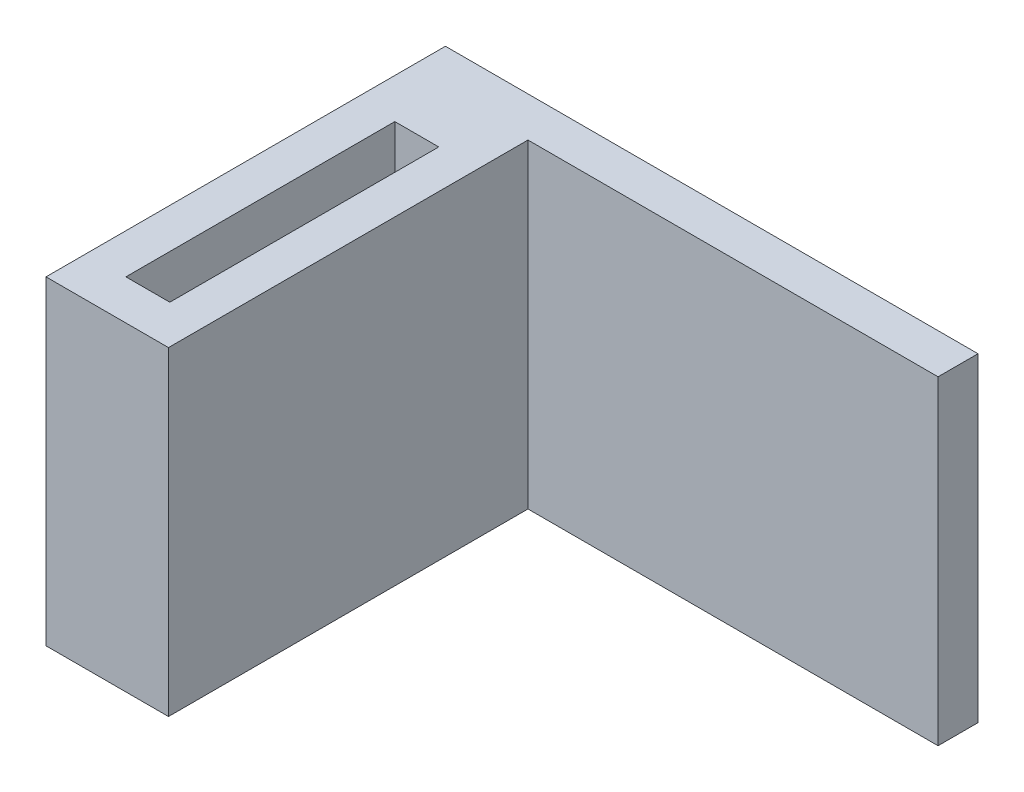
ISO-10303-21;
HEADER;
FILE_DESCRIPTION(('STEP AP214'),'2;1');
FILE_NAME('part.step','',(''),(''),'','','');
FILE_SCHEMA(('AUTOMOTIVE_DESIGN { 1 0 10303 214 1 1 1 1 }'));
ENDSEC;
DATA;
#1=APPLICATION_CONTEXT('core data for automotive mechanical design processes');
#2=APPLICATION_PROTOCOL_DEFINITION('international standard','automotive_design',2000,#1);
#3=PRODUCT_CONTEXT('',#1,'mechanical');
#4=PRODUCT('Part','Part','',(#3));
#5=PRODUCT_RELATED_PRODUCT_CATEGORY('part','',(#4));
#6=PRODUCT_DEFINITION_FORMATION('','',#4);
#7=PRODUCT_DEFINITION_CONTEXT('part definition',#1,'design');
#8=PRODUCT_DEFINITION('design','',#6,#7);
#9=PRODUCT_DEFINITION_SHAPE('','',#8);
#10=(LENGTH_UNIT() NAMED_UNIT(*) SI_UNIT(.MILLI.,.METRE.));
#11=(NAMED_UNIT(*) PLANE_ANGLE_UNIT() SI_UNIT($,.RADIAN.));
#12=(NAMED_UNIT(*) SI_UNIT($,.STERADIAN.) SOLID_ANGLE_UNIT());
#13=UNCERTAINTY_MEASURE_WITH_UNIT(LENGTH_MEASURE(1.E-05),#10,'distance_accuracy_value','');
#14=(GEOMETRIC_REPRESENTATION_CONTEXT(3) GLOBAL_UNCERTAINTY_ASSIGNED_CONTEXT((#13)) GLOBAL_UNIT_ASSIGNED_CONTEXT((#10,
#11,#12)) REPRESENTATION_CONTEXT('',''));
#15=CARTESIAN_POINT('',(0.,0.,0.));
#16=DIRECTION('',(0.,0.,1.));
#17=DIRECTION('',(1.,0.,0.));
#18=AXIS2_PLACEMENT_3D('',#15,#16,#17);
#19=CARTESIAN_POINT('',(4.6,1.5,-13.5));
#20=DIRECTION('',(1.,0.,0.));
#21=DIRECTION('',(0.,0.,-1.));
#22=AXIS2_PLACEMENT_3D('',#19,#20,#21);
#23=PLANE('',#22);
#24=DIRECTION('',(0.,0.,1.));
#25=VECTOR('',#24,1.);
#26=CARTESIAN_POINT('',(4.6,0.,-13.5));
#27=LINE('',#26,#25);
#28=CARTESIAN_POINT('',(4.6,0.,-13.5));
#29=VERTEX_POINT('',#28);
#30=CARTESIAN_POINT('',(4.6,0.,0.));
#31=VERTEX_POINT('',#30);
#32=EDGE_CURVE('E168',#29,#31,#27,.T.);
#33=ORIENTED_EDGE('',*,*,#32,.F.);
#34=DIRECTION('',(0.,-1.,0.));
#35=VECTOR('',#34,1.);
#36=CARTESIAN_POINT('',(4.6,1.5,-13.5));
#37=LINE('',#36,#35);
#38=CARTESIAN_POINT('',(4.6,12.,-13.5));
#39=VERTEX_POINT('',#38);
#40=EDGE_CURVE('E11',#39,#29,#37,.T.);
#41=ORIENTED_EDGE('',*,*,#40,.F.);
#42=DIRECTION('',(0.,0.,-1.));
#43=VECTOR('',#42,1.);
#44=CARTESIAN_POINT('',(4.6,12.,-13.5));
#45=LINE('',#44,#43);
#46=CARTESIAN_POINT('',(4.6,12.,0.));
#47=VERTEX_POINT('',#46);
#48=EDGE_CURVE('E144',#47,#39,#45,.T.);
#49=ORIENTED_EDGE('',*,*,#48,.F.);
#50=DIRECTION('',(0.,-1.,0.));
#51=VECTOR('',#50,1.);
#52=CARTESIAN_POINT('',(4.6,1.5,0.));
#53=LINE('',#52,#51);
#54=EDGE_CURVE('E35',#47,#31,#53,.T.);
#55=ORIENTED_EDGE('',*,*,#54,.T.);
#56=EDGE_LOOP('',(#33,#41,#49,#55));
#57=FACE_BOUND('',#56,.T.);
#58=ADVANCED_FACE('F32',(#57),#23,.T.);
#59=CARTESIAN_POINT('',(20.,1.5,-13.5));
#60=DIRECTION('',(0.,0.,1.));
#61=DIRECTION('',(1.,0.,0.));
#62=AXIS2_PLACEMENT_3D('',#59,#60,#61);
#63=PLANE('',#62);
#64=DIRECTION('',(-1.,0.,0.));
#65=VECTOR('',#64,1.);
#66=CARTESIAN_POINT('',(20.,0.,-13.5));
#67=LINE('',#66,#65);
#68=CARTESIAN_POINT('',(20.,0.,-13.5));
#69=VERTEX_POINT('',#68);
#70=EDGE_CURVE('E183',#69,#29,#67,.T.);
#71=ORIENTED_EDGE('',*,*,#70,.F.);
#72=DIRECTION('',(0.,-1.,0.));
#73=VECTOR('',#72,1.);
#74=CARTESIAN_POINT('',(20.,1.5,-13.5));
#75=LINE('',#74,#73);
#76=CARTESIAN_POINT('',(20.,12.,-13.5));
#77=VERTEX_POINT('',#76);
#78=EDGE_CURVE('E40',#77,#69,#75,.T.);
#79=ORIENTED_EDGE('',*,*,#78,.F.);
#80=DIRECTION('',(1.,0.,0.));
#81=VECTOR('',#80,1.);
#82=CARTESIAN_POINT('',(20.,12.,-13.5));
#83=LINE('',#82,#81);
#84=EDGE_CURVE('E147',#39,#77,#83,.T.);
#85=ORIENTED_EDGE('',*,*,#84,.F.);
#86=ORIENTED_EDGE('',*,*,#40,.T.);
#87=EDGE_LOOP('',(#71,#79,#85,#86));
#88=FACE_BOUND('',#87,.T.);
#89=ADVANCED_FACE('F201',(#88),#63,.T.);
#90=CARTESIAN_POINT('',(20.,1.5,-15.));
#91=DIRECTION('',(1.,0.,0.));
#92=DIRECTION('',(0.,0.,-1.));
#93=AXIS2_PLACEMENT_3D('',#90,#91,#92);
#94=PLANE('',#93);
#95=DIRECTION('',(0.,0.,1.));
#96=VECTOR('',#95,1.);
#97=CARTESIAN_POINT('',(20.,0.,-15.));
#98=LINE('',#97,#96);
#99=CARTESIAN_POINT('',(20.,0.,-15.));
#100=VERTEX_POINT('',#99);
#101=EDGE_CURVE('E180',#100,#69,#98,.T.);
#102=ORIENTED_EDGE('',*,*,#101,.F.);
#103=DIRECTION('',(0.,-1.,0.));
#104=VECTOR('',#103,1.);
#105=CARTESIAN_POINT('',(20.,1.5,-15.));
#106=LINE('',#105,#104);
#107=CARTESIAN_POINT('',(20.,12.,-15.));
#108=VERTEX_POINT('',#107);
#109=EDGE_CURVE('E187',#108,#100,#106,.T.);
#110=ORIENTED_EDGE('',*,*,#109,.F.);
#111=DIRECTION('',(0.,0.,-1.));
#112=VECTOR('',#111,1.);
#113=CARTESIAN_POINT('',(20.,12.,-15.));
#114=LINE('',#113,#112);
#115=EDGE_CURVE('E150',#77,#108,#114,.T.);
#116=ORIENTED_EDGE('',*,*,#115,.F.);
#117=ORIENTED_EDGE('',*,*,#78,.T.);
#118=EDGE_LOOP('',(#102,#110,#116,#117));
#119=FACE_BOUND('',#118,.T.);
#120=ADVANCED_FACE('F206',(#119),#94,.T.);
#121=CARTESIAN_POINT('',(0.,1.5,-15.));
#122=DIRECTION('',(0.,0.,-1.));
#123=DIRECTION('',(-1.,0.,0.));
#124=AXIS2_PLACEMENT_3D('',#121,#122,#123);
#125=PLANE('',#124);
#126=DIRECTION('',(1.,0.,0.));
#127=VECTOR('',#126,1.);
#128=CARTESIAN_POINT('',(0.,0.,-15.));
#129=LINE('',#128,#127);
#130=CARTESIAN_POINT('',(0.,0.,-15.));
#131=VERTEX_POINT('',#130);
#132=EDGE_CURVE('E177',#131,#100,#129,.T.);
#133=ORIENTED_EDGE('',*,*,#132,.F.);
#134=DIRECTION('',(0.,-1.,0.));
#135=VECTOR('',#134,1.);
#136=CARTESIAN_POINT('',(0.,1.5,-15.));
#137=LINE('',#136,#135);
#138=CARTESIAN_POINT('',(0.,12.,-15.));
#139=VERTEX_POINT('',#138);
#140=EDGE_CURVE('E189',#139,#131,#137,.T.);
#141=ORIENTED_EDGE('',*,*,#140,.F.);
#142=DIRECTION('',(-1.,0.,0.));
#143=VECTOR('',#142,1.);
#144=CARTESIAN_POINT('',(0.,12.,-15.));
#145=LINE('',#144,#143);
#146=EDGE_CURVE('E153',#108,#139,#145,.T.);
#147=ORIENTED_EDGE('',*,*,#146,.F.);
#148=ORIENTED_EDGE('',*,*,#109,.T.);
#149=EDGE_LOOP('',(#133,#141,#147,#148));
#150=FACE_BOUND('',#149,.T.);
#151=ADVANCED_FACE('F209',(#150),#125,.T.);
#152=CARTESIAN_POINT('',(0.,1.5,0.));
#153=DIRECTION('',(-1.,0.,0.));
#154=DIRECTION('',(0.,0.,1.));
#155=AXIS2_PLACEMENT_3D('',#152,#153,#154);
#156=PLANE('',#155);
#157=DIRECTION('',(0.,0.,-1.));
#158=VECTOR('',#157,1.);
#159=CARTESIAN_POINT('',(0.,0.,0.));
#160=LINE('',#159,#158);
#161=CARTESIAN_POINT('',(0.,0.,0.));
#162=VERTEX_POINT('',#161);
#163=EDGE_CURVE('E174',#162,#131,#160,.T.);
#164=ORIENTED_EDGE('',*,*,#163,.F.);
#165=DIRECTION('',(0.,-1.,0.));
#166=VECTOR('',#165,1.);
#167=CARTESIAN_POINT('',(0.,1.5,0.));
#168=LINE('',#167,#166);
#169=CARTESIAN_POINT('',(0.,12.,0.));
#170=VERTEX_POINT('',#169);
#171=EDGE_CURVE('E190',#170,#162,#168,.T.);
#172=ORIENTED_EDGE('',*,*,#171,.F.);
#173=DIRECTION('',(0.,0.,1.));
#174=VECTOR('',#173,1.);
#175=CARTESIAN_POINT('',(0.,12.,0.));
#176=LINE('',#175,#174);
#177=EDGE_CURVE('E156',#139,#170,#176,.T.);
#178=ORIENTED_EDGE('',*,*,#177,.F.);
#179=ORIENTED_EDGE('',*,*,#140,.T.);
#180=EDGE_LOOP('',(#164,#172,#178,#179));
#181=FACE_BOUND('',#180,.T.);
#182=ADVANCED_FACE('F212',(#181),#156,.T.);
#183=CARTESIAN_POINT('',(4.6,1.5,0.));
#184=DIRECTION('',(0.,0.,1.));
#185=DIRECTION('',(1.,0.,0.));
#186=AXIS2_PLACEMENT_3D('',#183,#184,#185);
#187=PLANE('',#186);
#188=DIRECTION('',(-1.,0.,0.));
#189=VECTOR('',#188,1.);
#190=CARTESIAN_POINT('',(4.6,0.,0.));
#191=LINE('',#190,#189);
#192=EDGE_CURVE('E171',#31,#162,#191,.T.);
#193=ORIENTED_EDGE('',*,*,#192,.F.);
#194=ORIENTED_EDGE('',*,*,#54,.F.);
#195=DIRECTION('',(1.,0.,0.));
#196=VECTOR('',#195,1.);
#197=CARTESIAN_POINT('',(4.6,12.,0.));
#198=LINE('',#197,#196);
#199=EDGE_CURVE('E125',#170,#47,#198,.T.);
#200=ORIENTED_EDGE('',*,*,#199,.F.);
#201=ORIENTED_EDGE('',*,*,#171,.T.);
#202=EDGE_LOOP('',(#193,#194,#200,#201));
#203=FACE_BOUND('',#202,.T.);
#204=ADVANCED_FACE('F197',(#203),#187,.T.);
#205=CARTESIAN_POINT('',(0.,0.,0.));
#206=DIRECTION('',(0.,-1.,0.));
#207=DIRECTION('',(0.,0.,-1.));
#208=AXIS2_PLACEMENT_3D('',#205,#206,#207);
#209=PLANE('',#208);
#210=ORIENTED_EDGE('',*,*,#32,.T.);
#211=ORIENTED_EDGE('',*,*,#192,.T.);
#212=ORIENTED_EDGE('',*,*,#163,.T.);
#213=ORIENTED_EDGE('',*,*,#132,.T.);
#214=ORIENTED_EDGE('',*,*,#101,.T.);
#215=ORIENTED_EDGE('',*,*,#70,.T.);
#216=EDGE_LOOP('',(#210,#211,#212,#213,#214,#215));
#217=FACE_BOUND('',#216,.T.);
#218=ADVANCED_FACE('F199',(#217),#209,.T.);
#219=CARTESIAN_POINT('',(1.5,12.,-1.5));
#220=DIRECTION('',(1.,0.,0.));
#221=DIRECTION('',(0.,0.,-1.));
#222=AXIS2_PLACEMENT_3D('',#219,#220,#221);
#223=PLANE('',#222);
#224=DIRECTION('',(0.,0.,1.));
#225=VECTOR('',#224,1.);
#226=CARTESIAN_POINT('',(1.5,1.5,0.));
#227=LINE('',#226,#225);
#228=CARTESIAN_POINT('',(1.5,1.5,-11.6));
#229=VERTEX_POINT('',#228);
#230=CARTESIAN_POINT('',(1.5,1.5,-1.5));
#231=VERTEX_POINT('',#230);
#232=EDGE_CURVE('E166',#229,#231,#227,.T.);
#233=ORIENTED_EDGE('',*,*,#232,.F.);
#234=DIRECTION('',(0.,-1.,0.));
#235=VECTOR('',#234,1.);
#236=CARTESIAN_POINT('',(1.5,12.,-11.6));
#237=LINE('',#236,#235);
#238=CARTESIAN_POINT('',(1.5,12.,-11.6));
#239=VERTEX_POINT('',#238);
#240=EDGE_CURVE('E48',#239,#229,#237,.T.);
#241=ORIENTED_EDGE('',*,*,#240,.F.);
#242=DIRECTION('',(0.,0.,1.));
#243=VECTOR('',#242,1.);
#244=CARTESIAN_POINT('',(1.5,12.,-1.5));
#245=LINE('',#244,#243);
#246=CARTESIAN_POINT('',(1.5,12.,-1.5));
#247=VERTEX_POINT('',#246);
#248=EDGE_CURVE('E109',#239,#247,#245,.T.);
#249=ORIENTED_EDGE('',*,*,#248,.T.);
#250=DIRECTION('',(0.,-1.,0.));
#251=VECTOR('',#250,1.);
#252=CARTESIAN_POINT('',(1.5,12.,-1.5));
#253=LINE('',#252,#251);
#254=EDGE_CURVE('E112',#247,#231,#253,.T.);
#255=ORIENTED_EDGE('',*,*,#254,.T.);
#256=EDGE_LOOP('',(#233,#241,#249,#255));
#257=FACE_BOUND('',#256,.T.);
#258=ADVANCED_FACE('F111',(#257),#223,.T.);
#259=CARTESIAN_POINT('',(1.5,12.,-1.5));
#260=DIRECTION('',(0.,0.,-1.));
#261=DIRECTION('',(-1.,0.,0.));
#262=AXIS2_PLACEMENT_3D('',#259,#260,#261);
#263=PLANE('',#262);
#264=DIRECTION('',(1.,0.,0.));
#265=VECTOR('',#264,1.);
#266=CARTESIAN_POINT('',(0.,1.5,-1.5));
#267=LINE('',#266,#265);
#268=CARTESIAN_POINT('',(3.15,1.5,-1.5));
#269=VERTEX_POINT('',#268);
#270=EDGE_CURVE('E124',#231,#269,#267,.T.);
#271=ORIENTED_EDGE('',*,*,#270,.F.);
#272=ORIENTED_EDGE('',*,*,#254,.F.);
#273=DIRECTION('',(1.,0.,0.));
#274=VECTOR('',#273,1.);
#275=CARTESIAN_POINT('',(1.5,12.,-1.5));
#276=LINE('',#275,#274);
#277=CARTESIAN_POINT('',(3.15,12.,-1.5));
#278=VERTEX_POINT('',#277);
#279=EDGE_CURVE('E117',#247,#278,#276,.T.);
#280=ORIENTED_EDGE('',*,*,#279,.T.);
#281=DIRECTION('',(0.,-1.,0.));
#282=VECTOR('',#281,1.);
#283=CARTESIAN_POINT('',(3.15,12.,-1.5));
#284=LINE('',#283,#282);
#285=EDGE_CURVE('E126',#278,#269,#284,.T.);
#286=ORIENTED_EDGE('',*,*,#285,.T.);
#287=EDGE_LOOP('',(#271,#272,#280,#286));
#288=FACE_BOUND('',#287,.T.);
#289=ADVANCED_FACE('F120',(#288),#263,.T.);
#290=CARTESIAN_POINT('',(3.15,12.,-1.5));
#291=DIRECTION('',(-1.,0.,0.));
#292=DIRECTION('',(0.,0.,1.));
#293=AXIS2_PLACEMENT_3D('',#290,#291,#292);
#294=PLANE('',#293);
#295=DIRECTION('',(0.,0.,-1.));
#296=VECTOR('',#295,1.);
#297=CARTESIAN_POINT('',(3.15,1.5,0.));
#298=LINE('',#297,#296);
#299=CARTESIAN_POINT('',(3.15,1.5,-11.6));
#300=VERTEX_POINT('',#299);
#301=EDGE_CURVE('E162',#269,#300,#298,.T.);
#302=ORIENTED_EDGE('',*,*,#301,.F.);
#303=ORIENTED_EDGE('',*,*,#285,.F.);
#304=DIRECTION('',(0.,0.,-1.));
#305=VECTOR('',#304,1.);
#306=CARTESIAN_POINT('',(3.15,12.,-1.5));
#307=LINE('',#306,#305);
#308=CARTESIAN_POINT('',(3.15,12.,-11.6));
#309=VERTEX_POINT('',#308);
#310=EDGE_CURVE('E131',#278,#309,#307,.T.);
#311=ORIENTED_EDGE('',*,*,#310,.T.);
#312=DIRECTION('',(0.,-1.,0.));
#313=VECTOR('',#312,1.);
#314=CARTESIAN_POINT('',(3.15,12.,-11.6));
#315=LINE('',#314,#313);
#316=EDGE_CURVE('E138',#309,#300,#315,.T.);
#317=ORIENTED_EDGE('',*,*,#316,.T.);
#318=EDGE_LOOP('',(#302,#303,#311,#317));
#319=FACE_BOUND('',#318,.T.);
#320=ADVANCED_FACE('F243',(#319),#294,.T.);
#321=CARTESIAN_POINT('',(1.5,12.,-11.6));
#322=DIRECTION('',(0.,0.,1.));
#323=DIRECTION('',(1.,0.,0.));
#324=AXIS2_PLACEMENT_3D('',#321,#322,#323);
#325=PLANE('',#324);
#326=DIRECTION('',(-1.,0.,0.));
#327=VECTOR('',#326,1.);
#328=CARTESIAN_POINT('',(0.,1.5,-11.6));
#329=LINE('',#328,#327);
#330=EDGE_CURVE('E159',#300,#229,#329,.T.);
#331=ORIENTED_EDGE('',*,*,#330,.F.);
#332=ORIENTED_EDGE('',*,*,#316,.F.);
#333=DIRECTION('',(-1.,0.,0.));
#334=VECTOR('',#333,1.);
#335=CARTESIAN_POINT('',(1.5,12.,-11.6));
#336=LINE('',#335,#334);
#337=EDGE_CURVE('E133',#309,#239,#336,.T.);
#338=ORIENTED_EDGE('',*,*,#337,.T.);
#339=ORIENTED_EDGE('',*,*,#240,.T.);
#340=EDGE_LOOP('',(#331,#332,#338,#339));
#341=FACE_BOUND('',#340,.T.);
#342=ADVANCED_FACE('F238',(#341),#325,.T.);
#343=CARTESIAN_POINT('',(0.,12.,0.));
#344=DIRECTION('',(0.,-1.,0.));
#345=DIRECTION('',(0.,0.,-1.));
#346=AXIS2_PLACEMENT_3D('',#343,#344,#345);
#347=PLANE('',#346);
#348=ORIENTED_EDGE('',*,*,#199,.T.);
#349=ORIENTED_EDGE('',*,*,#48,.T.);
#350=ORIENTED_EDGE('',*,*,#84,.T.);
#351=ORIENTED_EDGE('',*,*,#115,.T.);
#352=ORIENTED_EDGE('',*,*,#146,.T.);
#353=ORIENTED_EDGE('',*,*,#177,.T.);
#354=EDGE_LOOP('',(#348,#349,#350,#351,#352,#353));
#355=FACE_BOUND('',#354,.T.);
#356=ORIENTED_EDGE('',*,*,#248,.F.);
#357=ORIENTED_EDGE('',*,*,#337,.F.);
#358=ORIENTED_EDGE('',*,*,#310,.F.);
#359=ORIENTED_EDGE('',*,*,#279,.F.);
#360=EDGE_LOOP('',(#356,#357,#358,#359));
#361=FACE_BOUND('',#360,.T.);
#362=ADVANCED_FACE('F129',(#355,#361),#347,.F.);
#363=CARTESIAN_POINT('',(0.,1.5,0.));
#364=DIRECTION('',(0.,-1.,0.));
#365=DIRECTION('',(0.,0.,-1.));
#366=AXIS2_PLACEMENT_3D('',#363,#364,#365);
#367=PLANE('',#366);
#368=ORIENTED_EDGE('',*,*,#330,.T.);
#369=ORIENTED_EDGE('',*,*,#232,.T.);
#370=ORIENTED_EDGE('',*,*,#270,.T.);
#371=ORIENTED_EDGE('',*,*,#301,.T.);
#372=EDGE_LOOP('',(#368,#369,#370,#371));
#373=FACE_BOUND('',#372,.T.);
#374=ADVANCED_FACE('F232',(#373),#367,.F.);
#375=CLOSED_SHELL('',(#58,#89,#120,#151,#182,#204,#218,#258,#289,#320,#342,#362,#374));
#376=MANIFOLD_SOLID_BREP('B2',#375);
#377=ADVANCED_BREP_SHAPE_REPRESENTATION('',(#18,#376),#14);
#378=SHAPE_DEFINITION_REPRESENTATION(#9,#377);
ENDSEC;
END-ISO-10303-21;
